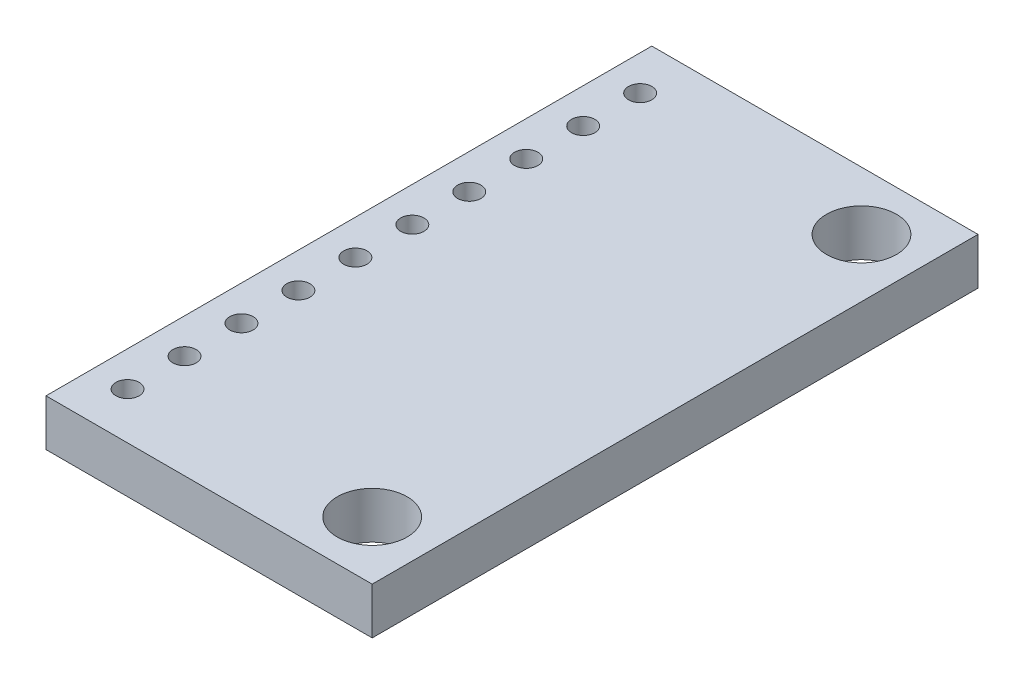
ISO-10303-21;
HEADER;
FILE_DESCRIPTION(('STEP AP214'),'2;1');
FILE_NAME('part.step','',(''),(''),'','','');
FILE_SCHEMA(('AUTOMOTIVE_DESIGN { 1 0 10303 214 1 1 1 1 }'));
ENDSEC;
DATA;
#1=APPLICATION_CONTEXT('core data for automotive mechanical design processes');
#2=APPLICATION_PROTOCOL_DEFINITION('international standard','automotive_design',2000,#1);
#3=PRODUCT_CONTEXT('',#1,'mechanical');
#4=PRODUCT('Part','Part','',(#3));
#5=PRODUCT_RELATED_PRODUCT_CATEGORY('part','',(#4));
#6=PRODUCT_DEFINITION_FORMATION('','',#4);
#7=PRODUCT_DEFINITION_CONTEXT('part definition',#1,'design');
#8=PRODUCT_DEFINITION('design','',#6,#7);
#9=PRODUCT_DEFINITION_SHAPE('','',#8);
#10=(LENGTH_UNIT() NAMED_UNIT(*) SI_UNIT(.MILLI.,.METRE.));
#11=(NAMED_UNIT(*) PLANE_ANGLE_UNIT() SI_UNIT($,.RADIAN.));
#12=(NAMED_UNIT(*) SI_UNIT($,.STERADIAN.) SOLID_ANGLE_UNIT());
#13=UNCERTAINTY_MEASURE_WITH_UNIT(LENGTH_MEASURE(1.E-05),#10,'distance_accuracy_value','');
#14=(GEOMETRIC_REPRESENTATION_CONTEXT(3) GLOBAL_UNCERTAINTY_ASSIGNED_CONTEXT((#13)) GLOBAL_UNIT_ASSIGNED_CONTEXT((#10,
#11,#12)) REPRESENTATION_CONTEXT('',''));
#15=CARTESIAN_POINT('',(0.,0.,0.));
#16=DIRECTION('',(0.,0.,1.));
#17=DIRECTION('',(1.,0.,0.));
#18=AXIS2_PLACEMENT_3D('',#15,#16,#17);
#19=CARTESIAN_POINT('',(7.,2.,13.));
#20=DIRECTION('',(-1.,0.,0.));
#21=DIRECTION('',(0.,0.,1.));
#22=AXIS2_PLACEMENT_3D('',#19,#20,#21);
#23=PLANE('',#22);
#24=DIRECTION('',(0.,0.,-1.));
#25=VECTOR('',#24,1.);
#26=CARTESIAN_POINT('',(7.,0.,13.));
#27=LINE('',#26,#25);
#28=CARTESIAN_POINT('',(7.,0.,13.));
#29=VERTEX_POINT('',#28);
#30=CARTESIAN_POINT('',(7.,0.,-13.));
#31=VERTEX_POINT('',#30);
#32=EDGE_CURVE('E111',#29,#31,#27,.T.);
#33=ORIENTED_EDGE('',*,*,#32,.T.);
#34=DIRECTION('',(0.,-1.,0.));
#35=VECTOR('',#34,1.);
#36=CARTESIAN_POINT('',(7.,2.,-13.));
#37=LINE('',#36,#35);
#38=CARTESIAN_POINT('',(7.,2.,-13.));
#39=VERTEX_POINT('',#38);
#40=EDGE_CURVE('E11',#39,#31,#37,.T.);
#41=ORIENTED_EDGE('',*,*,#40,.F.);
#42=DIRECTION('',(0.,0.,-1.));
#43=VECTOR('',#42,1.);
#44=CARTESIAN_POINT('',(7.,2.,13.));
#45=LINE('',#44,#43);
#46=CARTESIAN_POINT('',(7.,2.,13.));
#47=VERTEX_POINT('',#46);
#48=EDGE_CURVE('E95',#47,#39,#45,.T.);
#49=ORIENTED_EDGE('',*,*,#48,.F.);
#50=DIRECTION('',(0.,-1.,0.));
#51=VECTOR('',#50,1.);
#52=CARTESIAN_POINT('',(7.,2.,13.));
#53=LINE('',#52,#51);
#54=EDGE_CURVE('E107',#47,#29,#53,.T.);
#55=ORIENTED_EDGE('',*,*,#54,.T.);
#56=EDGE_LOOP('',(#33,#41,#49,#55));
#57=FACE_BOUND('',#56,.T.);
#58=ADVANCED_FACE('F43',(#57),#23,.F.);
#59=CARTESIAN_POINT('',(-7.,2.,-13.));
#60=DIRECTION('',(0.,0.,1.));
#61=DIRECTION('',(1.,0.,0.));
#62=AXIS2_PLACEMENT_3D('',#59,#60,#61);
#63=PLANE('',#62);
#64=DIRECTION('',(-1.,0.,0.));
#65=VECTOR('',#64,1.);
#66=CARTESIAN_POINT('',(-7.,0.,-13.));
#67=LINE('',#66,#65);
#68=CARTESIAN_POINT('',(-7.,0.,-13.));
#69=VERTEX_POINT('',#68);
#70=EDGE_CURVE('E100',#31,#69,#67,.T.);
#71=ORIENTED_EDGE('',*,*,#70,.T.);
#72=DIRECTION('',(0.,-1.,0.));
#73=VECTOR('',#72,1.);
#74=CARTESIAN_POINT('',(-7.,2.,-13.));
#75=LINE('',#74,#73);
#76=CARTESIAN_POINT('',(-7.,2.,-13.));
#77=VERTEX_POINT('',#76);
#78=EDGE_CURVE('E52',#77,#69,#75,.T.);
#79=ORIENTED_EDGE('',*,*,#78,.F.);
#80=DIRECTION('',(-1.,0.,0.));
#81=VECTOR('',#80,1.);
#82=CARTESIAN_POINT('',(-7.,2.,-13.));
#83=LINE('',#82,#81);
#84=EDGE_CURVE('E90',#39,#77,#83,.T.);
#85=ORIENTED_EDGE('',*,*,#84,.F.);
#86=ORIENTED_EDGE('',*,*,#40,.T.);
#87=EDGE_LOOP('',(#71,#79,#85,#86));
#88=FACE_BOUND('',#87,.T.);
#89=ADVANCED_FACE('F99',(#88),#63,.F.);
#90=CARTESIAN_POINT('',(-7.,2.,13.));
#91=DIRECTION('',(1.,0.,0.));
#92=DIRECTION('',(0.,0.,-1.));
#93=AXIS2_PLACEMENT_3D('',#90,#91,#92);
#94=PLANE('',#93);
#95=DIRECTION('',(0.,0.,1.));
#96=VECTOR('',#95,1.);
#97=CARTESIAN_POINT('',(-7.,0.,13.));
#98=LINE('',#97,#96);
#99=CARTESIAN_POINT('',(-7.,0.,13.));
#100=VERTEX_POINT('',#99);
#101=EDGE_CURVE('E77',#69,#100,#98,.T.);
#102=ORIENTED_EDGE('',*,*,#101,.T.);
#103=DIRECTION('',(0.,-1.,0.));
#104=VECTOR('',#103,1.);
#105=CARTESIAN_POINT('',(-7.,2.,13.));
#106=LINE('',#105,#104);
#107=CARTESIAN_POINT('',(-7.,2.,13.));
#108=VERTEX_POINT('',#107);
#109=EDGE_CURVE('E102',#108,#100,#106,.T.);
#110=ORIENTED_EDGE('',*,*,#109,.F.);
#111=DIRECTION('',(0.,0.,1.));
#112=VECTOR('',#111,1.);
#113=CARTESIAN_POINT('',(-7.,2.,13.));
#114=LINE('',#113,#112);
#115=EDGE_CURVE('E93',#77,#108,#114,.T.);
#116=ORIENTED_EDGE('',*,*,#115,.F.);
#117=ORIENTED_EDGE('',*,*,#78,.T.);
#118=EDGE_LOOP('',(#102,#110,#116,#117));
#119=FACE_BOUND('',#118,.T.);
#120=ADVANCED_FACE('F103',(#119),#94,.F.);
#121=CARTESIAN_POINT('',(-7.,2.,13.));
#122=DIRECTION('',(0.,0.,-1.));
#123=DIRECTION('',(-1.,0.,0.));
#124=AXIS2_PLACEMENT_3D('',#121,#122,#123);
#125=PLANE('',#124);
#126=DIRECTION('',(1.,0.,0.));
#127=VECTOR('',#126,1.);
#128=CARTESIAN_POINT('',(-7.,0.,13.));
#129=LINE('',#128,#127);
#130=EDGE_CURVE('E83',#100,#29,#129,.T.);
#131=ORIENTED_EDGE('',*,*,#130,.T.);
#132=ORIENTED_EDGE('',*,*,#54,.F.);
#133=DIRECTION('',(1.,0.,0.));
#134=VECTOR('',#133,1.);
#135=CARTESIAN_POINT('',(-7.,2.,13.));
#136=LINE('',#135,#134);
#137=EDGE_CURVE('E60',#108,#47,#136,.T.);
#138=ORIENTED_EDGE('',*,*,#137,.F.);
#139=ORIENTED_EDGE('',*,*,#109,.T.);
#140=EDGE_LOOP('',(#131,#132,#138,#139));
#141=FACE_BOUND('',#140,.T.);
#142=ADVANCED_FACE('F125',(#141),#125,.F.);
#143=CARTESIAN_POINT('',(0.,2.,0.));
#144=DIRECTION('',(0.,-1.,0.));
#145=DIRECTION('',(0.,0.,-1.));
#146=AXIS2_PLACEMENT_3D('',#143,#144,#145);
#147=PLANE('',#146);
#148=CARTESIAN_POINT('',(-5.5,2.,-11.));
#149=DIRECTION('',(0.,1.,0.));
#150=DIRECTION('',(0.,0.,1.));
#151=AXIS2_PLACEMENT_3D('',#148,#149,#150);
#152=CIRCLE('',#151,0.500000000000001);
#153=CARTESIAN_POINT('',(-5.5,2.,-10.5));
#154=VERTEX_POINT('',#153);
#155=EDGE_CURVE('E220',#154,#154,#152,.T.);
#156=ORIENTED_EDGE('',*,*,#155,.F.);
#157=EDGE_LOOP('',(#156));
#158=FACE_BOUND('',#157,.T.);
#159=CARTESIAN_POINT('',(-5.5,2.,-8.555556));
#160=DIRECTION('',(0.,1.,0.));
#161=DIRECTION('',(0.,0.,1.));
#162=AXIS2_PLACEMENT_3D('',#159,#160,#161);
#163=CIRCLE('',#162,0.500000000000001);
#164=CARTESIAN_POINT('',(-5.5,2.,-8.055556));
#165=VERTEX_POINT('',#164);
#166=EDGE_CURVE('E216',#165,#165,#163,.T.);
#167=ORIENTED_EDGE('',*,*,#166,.F.);
#168=EDGE_LOOP('',(#167));
#169=FACE_BOUND('',#168,.T.);
#170=CARTESIAN_POINT('',(-5.5,2.,-6.111112));
#171=DIRECTION('',(0.,1.,0.));
#172=DIRECTION('',(0.,0.,1.));
#173=AXIS2_PLACEMENT_3D('',#170,#171,#172);
#174=CIRCLE('',#173,0.500000000000001);
#175=CARTESIAN_POINT('',(-5.5,2.,-5.611112));
#176=VERTEX_POINT('',#175);
#177=EDGE_CURVE('E208',#176,#176,#174,.T.);
#178=ORIENTED_EDGE('',*,*,#177,.F.);
#179=EDGE_LOOP('',(#178));
#180=FACE_BOUND('',#179,.T.);
#181=CARTESIAN_POINT('',(-5.5,2.,-3.666668));
#182=DIRECTION('',(0.,1.,0.));
#183=DIRECTION('',(0.,0.,1.));
#184=AXIS2_PLACEMENT_3D('',#181,#182,#183);
#185=CIRCLE('',#184,0.500000000000001);
#186=CARTESIAN_POINT('',(-5.5,2.,-3.166668));
#187=VERTEX_POINT('',#186);
#188=EDGE_CURVE('E200',#187,#187,#185,.T.);
#189=ORIENTED_EDGE('',*,*,#188,.F.);
#190=EDGE_LOOP('',(#189));
#191=FACE_BOUND('',#190,.T.);
#192=CARTESIAN_POINT('',(-5.5,2.,-1.222224));
#193=DIRECTION('',(0.,1.,0.));
#194=DIRECTION('',(0.,0.,1.));
#195=AXIS2_PLACEMENT_3D('',#192,#193,#194);
#196=CIRCLE('',#195,0.500000000000001);
#197=CARTESIAN_POINT('',(-5.5,2.,-0.722224));
#198=VERTEX_POINT('',#197);
#199=EDGE_CURVE('E192',#198,#198,#196,.T.);
#200=ORIENTED_EDGE('',*,*,#199,.F.);
#201=EDGE_LOOP('',(#200));
#202=FACE_BOUND('',#201,.T.);
#203=CARTESIAN_POINT('',(-5.5,2.,1.22222));
#204=DIRECTION('',(0.,1.,0.));
#205=DIRECTION('',(0.,0.,1.));
#206=AXIS2_PLACEMENT_3D('',#203,#204,#205);
#207=CIRCLE('',#206,0.500000000000001);
#208=CARTESIAN_POINT('',(-5.5,2.,1.72222));
#209=VERTEX_POINT('',#208);
#210=EDGE_CURVE('E184',#209,#209,#207,.T.);
#211=ORIENTED_EDGE('',*,*,#210,.F.);
#212=EDGE_LOOP('',(#211));
#213=FACE_BOUND('',#212,.T.);
#214=CARTESIAN_POINT('',(-5.5,2.,3.666664));
#215=DIRECTION('',(0.,1.,0.));
#216=DIRECTION('',(0.,0.,1.));
#217=AXIS2_PLACEMENT_3D('',#214,#215,#216);
#218=CIRCLE('',#217,0.500000000000001);
#219=CARTESIAN_POINT('',(-5.5,2.,4.166664));
#220=VERTEX_POINT('',#219);
#221=EDGE_CURVE('E176',#220,#220,#218,.T.);
#222=ORIENTED_EDGE('',*,*,#221,.F.);
#223=EDGE_LOOP('',(#222));
#224=FACE_BOUND('',#223,.T.);
#225=CARTESIAN_POINT('',(-5.5,2.,6.111108));
#226=DIRECTION('',(0.,1.,0.));
#227=DIRECTION('',(0.,0.,1.));
#228=AXIS2_PLACEMENT_3D('',#225,#226,#227);
#229=CIRCLE('',#228,0.500000000000001);
#230=CARTESIAN_POINT('',(-5.5,2.,6.611108));
#231=VERTEX_POINT('',#230);
#232=EDGE_CURVE('E168',#231,#231,#229,.T.);
#233=ORIENTED_EDGE('',*,*,#232,.F.);
#234=EDGE_LOOP('',(#233));
#235=FACE_BOUND('',#234,.T.);
#236=CARTESIAN_POINT('',(-5.5,2.,8.555552));
#237=DIRECTION('',(0.,1.,0.));
#238=DIRECTION('',(0.,0.,1.));
#239=AXIS2_PLACEMENT_3D('',#236,#237,#238);
#240=CIRCLE('',#239,0.500000000000001);
#241=CARTESIAN_POINT('',(-5.5,2.,9.055552));
#242=VERTEX_POINT('',#241);
#243=EDGE_CURVE('E160',#242,#242,#240,.T.);
#244=ORIENTED_EDGE('',*,*,#243,.F.);
#245=EDGE_LOOP('',(#244));
#246=FACE_BOUND('',#245,.T.);
#247=CARTESIAN_POINT('',(-5.5,2.,10.999996));
#248=DIRECTION('',(0.,1.,0.));
#249=DIRECTION('',(0.,0.,1.));
#250=AXIS2_PLACEMENT_3D('',#247,#248,#249);
#251=CIRCLE('',#250,0.500000000000001);
#252=CARTESIAN_POINT('',(-5.5,2.,11.499996));
#253=VERTEX_POINT('',#252);
#254=EDGE_CURVE('E152',#253,#253,#251,.T.);
#255=ORIENTED_EDGE('',*,*,#254,.F.);
#256=EDGE_LOOP('',(#255));
#257=FACE_BOUND('',#256,.T.);
#258=CARTESIAN_POINT('',(4.5,2.,-10.5));
#259=DIRECTION('',(0.,1.,0.));
#260=DIRECTION('',(0.,0.,1.));
#261=AXIS2_PLACEMENT_3D('',#258,#259,#260);
#262=CIRCLE('',#261,1.5);
#263=CARTESIAN_POINT('',(4.5,2.,-9.));
#264=VERTEX_POINT('',#263);
#265=EDGE_CURVE('E141',#264,#264,#262,.T.);
#266=ORIENTED_EDGE('',*,*,#265,.F.);
#267=EDGE_LOOP('',(#266));
#268=FACE_BOUND('',#267,.T.);
#269=CARTESIAN_POINT('',(4.5,2.,10.5));
#270=DIRECTION('',(0.,1.,0.));
#271=DIRECTION('',(0.,0.,1.));
#272=AXIS2_PLACEMENT_3D('',#269,#270,#271);
#273=CIRCLE('',#272,1.5);
#274=CARTESIAN_POINT('',(4.5,2.,12.));
#275=VERTEX_POINT('',#274);
#276=EDGE_CURVE('E136',#275,#275,#273,.T.);
#277=ORIENTED_EDGE('',*,*,#276,.F.);
#278=EDGE_LOOP('',(#277));
#279=FACE_BOUND('',#278,.T.);
#280=ORIENTED_EDGE('',*,*,#48,.T.);
#281=ORIENTED_EDGE('',*,*,#84,.T.);
#282=ORIENTED_EDGE('',*,*,#115,.T.);
#283=ORIENTED_EDGE('',*,*,#137,.T.);
#284=EDGE_LOOP('',(#280,#281,#282,#283));
#285=FACE_BOUND('',#284,.T.);
#286=ADVANCED_FACE('F91',(#158,#169,#180,#191,#202,#213,#224,#235,#246,#257,#268,#279,#285),
#147,.F.);
#287=CARTESIAN_POINT('',(0.,0.,0.));
#288=DIRECTION('',(0.,-1.,0.));
#289=DIRECTION('',(0.,0.,-1.));
#290=AXIS2_PLACEMENT_3D('',#287,#288,#289);
#291=PLANE('',#290);
#292=CARTESIAN_POINT('',(-5.5,0.,-11.));
#293=DIRECTION('',(0.,1.,0.));
#294=DIRECTION('',(0.,0.,1.));
#295=AXIS2_PLACEMENT_3D('',#292,#293,#294);
#296=CIRCLE('',#295,0.500000000000001);
#297=CARTESIAN_POINT('',(-5.5,0.,-10.5));
#298=VERTEX_POINT('',#297);
#299=EDGE_CURVE('E137',#298,#298,#296,.T.);
#300=ORIENTED_EDGE('',*,*,#299,.T.);
#301=EDGE_LOOP('',(#300));
#302=FACE_BOUND('',#301,.T.);
#303=CARTESIAN_POINT('',(-5.5,0.,-8.555556));
#304=DIRECTION('',(0.,1.,0.));
#305=DIRECTION('',(0.,0.,1.));
#306=AXIS2_PLACEMENT_3D('',#303,#304,#305);
#307=CIRCLE('',#306,0.500000000000001);
#308=CARTESIAN_POINT('',(-5.5,0.,-8.055556));
#309=VERTEX_POINT('',#308);
#310=EDGE_CURVE('E212',#309,#309,#307,.T.);
#311=ORIENTED_EDGE('',*,*,#310,.T.);
#312=EDGE_LOOP('',(#311));
#313=FACE_BOUND('',#312,.T.);
#314=CARTESIAN_POINT('',(-5.5,0.,-6.111112));
#315=DIRECTION('',(0.,1.,0.));
#316=DIRECTION('',(0.,0.,1.));
#317=AXIS2_PLACEMENT_3D('',#314,#315,#316);
#318=CIRCLE('',#317,0.500000000000001);
#319=CARTESIAN_POINT('',(-5.5,0.,-5.611112));
#320=VERTEX_POINT('',#319);
#321=EDGE_CURVE('E204',#320,#320,#318,.T.);
#322=ORIENTED_EDGE('',*,*,#321,.T.);
#323=EDGE_LOOP('',(#322));
#324=FACE_BOUND('',#323,.T.);
#325=CARTESIAN_POINT('',(-5.5,0.,-3.666668));
#326=DIRECTION('',(0.,1.,0.));
#327=DIRECTION('',(0.,0.,1.));
#328=AXIS2_PLACEMENT_3D('',#325,#326,#327);
#329=CIRCLE('',#328,0.500000000000001);
#330=CARTESIAN_POINT('',(-5.5,0.,-3.166668));
#331=VERTEX_POINT('',#330);
#332=EDGE_CURVE('E196',#331,#331,#329,.T.);
#333=ORIENTED_EDGE('',*,*,#332,.T.);
#334=EDGE_LOOP('',(#333));
#335=FACE_BOUND('',#334,.T.);
#336=CARTESIAN_POINT('',(-5.5,0.,-1.222224));
#337=DIRECTION('',(0.,1.,0.));
#338=DIRECTION('',(0.,0.,1.));
#339=AXIS2_PLACEMENT_3D('',#336,#337,#338);
#340=CIRCLE('',#339,0.500000000000001);
#341=CARTESIAN_POINT('',(-5.5,0.,-0.722224));
#342=VERTEX_POINT('',#341);
#343=EDGE_CURVE('E188',#342,#342,#340,.T.);
#344=ORIENTED_EDGE('',*,*,#343,.T.);
#345=EDGE_LOOP('',(#344));
#346=FACE_BOUND('',#345,.T.);
#347=CARTESIAN_POINT('',(-5.5,0.,1.22222));
#348=DIRECTION('',(0.,1.,0.));
#349=DIRECTION('',(0.,0.,1.));
#350=AXIS2_PLACEMENT_3D('',#347,#348,#349);
#351=CIRCLE('',#350,0.500000000000001);
#352=CARTESIAN_POINT('',(-5.5,0.,1.72222));
#353=VERTEX_POINT('',#352);
#354=EDGE_CURVE('E180',#353,#353,#351,.T.);
#355=ORIENTED_EDGE('',*,*,#354,.T.);
#356=EDGE_LOOP('',(#355));
#357=FACE_BOUND('',#356,.T.);
#358=CARTESIAN_POINT('',(-5.5,0.,3.666664));
#359=DIRECTION('',(0.,1.,0.));
#360=DIRECTION('',(0.,0.,1.));
#361=AXIS2_PLACEMENT_3D('',#358,#359,#360);
#362=CIRCLE('',#361,0.500000000000001);
#363=CARTESIAN_POINT('',(-5.5,0.,4.166664));
#364=VERTEX_POINT('',#363);
#365=EDGE_CURVE('E172',#364,#364,#362,.T.);
#366=ORIENTED_EDGE('',*,*,#365,.T.);
#367=EDGE_LOOP('',(#366));
#368=FACE_BOUND('',#367,.T.);
#369=CARTESIAN_POINT('',(-5.5,0.,6.111108));
#370=DIRECTION('',(0.,1.,0.));
#371=DIRECTION('',(0.,0.,1.));
#372=AXIS2_PLACEMENT_3D('',#369,#370,#371);
#373=CIRCLE('',#372,0.500000000000001);
#374=CARTESIAN_POINT('',(-5.5,0.,6.611108));
#375=VERTEX_POINT('',#374);
#376=EDGE_CURVE('E164',#375,#375,#373,.T.);
#377=ORIENTED_EDGE('',*,*,#376,.T.);
#378=EDGE_LOOP('',(#377));
#379=FACE_BOUND('',#378,.T.);
#380=CARTESIAN_POINT('',(-5.5,0.,8.555552));
#381=DIRECTION('',(0.,1.,0.));
#382=DIRECTION('',(0.,0.,1.));
#383=AXIS2_PLACEMENT_3D('',#380,#381,#382);
#384=CIRCLE('',#383,0.500000000000001);
#385=CARTESIAN_POINT('',(-5.5,0.,9.055552));
#386=VERTEX_POINT('',#385);
#387=EDGE_CURVE('E156',#386,#386,#384,.T.);
#388=ORIENTED_EDGE('',*,*,#387,.T.);
#389=EDGE_LOOP('',(#388));
#390=FACE_BOUND('',#389,.T.);
#391=CARTESIAN_POINT('',(-5.5,0.,10.999996));
#392=DIRECTION('',(0.,1.,0.));
#393=DIRECTION('',(0.,0.,1.));
#394=AXIS2_PLACEMENT_3D('',#391,#392,#393);
#395=CIRCLE('',#394,0.500000000000001);
#396=CARTESIAN_POINT('',(-5.5,0.,11.499996));
#397=VERTEX_POINT('',#396);
#398=EDGE_CURVE('E148',#397,#397,#395,.T.);
#399=ORIENTED_EDGE('',*,*,#398,.T.);
#400=EDGE_LOOP('',(#399));
#401=FACE_BOUND('',#400,.T.);
#402=CARTESIAN_POINT('',(4.5,0.,-10.5));
#403=DIRECTION('',(0.,1.,0.));
#404=DIRECTION('',(0.,0.,1.));
#405=AXIS2_PLACEMENT_3D('',#402,#403,#404);
#406=CIRCLE('',#405,1.5);
#407=CARTESIAN_POINT('',(4.5,0.,-9.));
#408=VERTEX_POINT('',#407);
#409=EDGE_CURVE('E115',#408,#408,#406,.T.);
#410=ORIENTED_EDGE('',*,*,#409,.T.);
#411=EDGE_LOOP('',(#410));
#412=FACE_BOUND('',#411,.T.);
#413=CARTESIAN_POINT('',(4.5,0.,10.5));
#414=DIRECTION('',(0.,1.,0.));
#415=DIRECTION('',(0.,0.,1.));
#416=AXIS2_PLACEMENT_3D('',#413,#414,#415);
#417=CIRCLE('',#416,1.5);
#418=CARTESIAN_POINT('',(4.5,0.,12.));
#419=VERTEX_POINT('',#418);
#420=EDGE_CURVE('E132',#419,#419,#417,.T.);
#421=ORIENTED_EDGE('',*,*,#420,.T.);
#422=EDGE_LOOP('',(#421));
#423=FACE_BOUND('',#422,.T.);
#424=ORIENTED_EDGE('',*,*,#32,.F.);
#425=ORIENTED_EDGE('',*,*,#130,.F.);
#426=ORIENTED_EDGE('',*,*,#101,.F.);
#427=ORIENTED_EDGE('',*,*,#70,.F.);
#428=EDGE_LOOP('',(#424,#425,#426,#427));
#429=FACE_BOUND('',#428,.T.);
#430=ADVANCED_FACE('F128',(#302,#313,#324,#335,#346,#357,#368,#379,#390,#401,#412,#423,#429),
#291,.T.);
#431=CARTESIAN_POINT('',(4.5,0.,10.5));
#432=DIRECTION('',(0.,1.,0.));
#433=DIRECTION('',(0.,0.,1.));
#434=AXIS2_PLACEMENT_3D('',#431,#432,#433);
#435=CYLINDRICAL_SURFACE('',#434,1.5);
#436=ORIENTED_EDGE('',*,*,#420,.F.);
#437=EDGE_LOOP('',(#436));
#438=FACE_BOUND('',#437,.T.);
#439=ORIENTED_EDGE('',*,*,#276,.T.);
#440=EDGE_LOOP('',(#439));
#441=FACE_BOUND('',#440,.T.);
#442=ADVANCED_FACE('F262',(#438,#441),#435,.F.);
#443=CARTESIAN_POINT('',(4.5,0.,-10.5));
#444=DIRECTION('',(0.,1.,0.));
#445=DIRECTION('',(0.,0.,1.));
#446=AXIS2_PLACEMENT_3D('',#443,#444,#445);
#447=CYLINDRICAL_SURFACE('',#446,1.5);
#448=ORIENTED_EDGE('',*,*,#409,.F.);
#449=EDGE_LOOP('',(#448));
#450=FACE_BOUND('',#449,.T.);
#451=ORIENTED_EDGE('',*,*,#265,.T.);
#452=EDGE_LOOP('',(#451));
#453=FACE_BOUND('',#452,.T.);
#454=ADVANCED_FACE('F264',(#450,#453),#447,.F.);
#455=CARTESIAN_POINT('',(-5.5,0.,10.999996));
#456=DIRECTION('',(0.,1.,0.));
#457=DIRECTION('',(0.,0.,1.));
#458=AXIS2_PLACEMENT_3D('',#455,#456,#457);
#459=CYLINDRICAL_SURFACE('',#458,0.500000000000001);
#460=ORIENTED_EDGE('',*,*,#398,.F.);
#461=EDGE_LOOP('',(#460));
#462=FACE_BOUND('',#461,.T.);
#463=ORIENTED_EDGE('',*,*,#254,.T.);
#464=EDGE_LOOP('',(#463));
#465=FACE_BOUND('',#464,.T.);
#466=ADVANCED_FACE('F271',(#462,#465),#459,.F.);
#467=CARTESIAN_POINT('',(-5.5,0.,8.555552));
#468=DIRECTION('',(0.,1.,0.));
#469=DIRECTION('',(0.,0.,1.));
#470=AXIS2_PLACEMENT_3D('',#467,#468,#469);
#471=CYLINDRICAL_SURFACE('',#470,0.500000000000001);
#472=ORIENTED_EDGE('',*,*,#387,.F.);
#473=EDGE_LOOP('',(#472));
#474=FACE_BOUND('',#473,.T.);
#475=ORIENTED_EDGE('',*,*,#243,.T.);
#476=EDGE_LOOP('',(#475));
#477=FACE_BOUND('',#476,.T.);
#478=ADVANCED_FACE('F310',(#474,#477),#471,.F.);
#479=CARTESIAN_POINT('',(-5.5,0.,6.111108));
#480=DIRECTION('',(0.,1.,0.));
#481=DIRECTION('',(0.,0.,1.));
#482=AXIS2_PLACEMENT_3D('',#479,#480,#481);
#483=CYLINDRICAL_SURFACE('',#482,0.500000000000001);
#484=ORIENTED_EDGE('',*,*,#376,.F.);
#485=EDGE_LOOP('',(#484));
#486=FACE_BOUND('',#485,.T.);
#487=ORIENTED_EDGE('',*,*,#232,.T.);
#488=EDGE_LOOP('',(#487));
#489=FACE_BOUND('',#488,.T.);
#490=ADVANCED_FACE('F322',(#486,#489),#483,.F.);
#491=CARTESIAN_POINT('',(-5.5,0.,3.666664));
#492=DIRECTION('',(0.,1.,0.));
#493=DIRECTION('',(0.,0.,1.));
#494=AXIS2_PLACEMENT_3D('',#491,#492,#493);
#495=CYLINDRICAL_SURFACE('',#494,0.500000000000001);
#496=ORIENTED_EDGE('',*,*,#365,.F.);
#497=EDGE_LOOP('',(#496));
#498=FACE_BOUND('',#497,.T.);
#499=ORIENTED_EDGE('',*,*,#221,.T.);
#500=EDGE_LOOP('',(#499));
#501=FACE_BOUND('',#500,.T.);
#502=ADVANCED_FACE('F333',(#498,#501),#495,.F.);
#503=CARTESIAN_POINT('',(-5.5,0.,1.22222));
#504=DIRECTION('',(0.,1.,0.));
#505=DIRECTION('',(0.,0.,1.));
#506=AXIS2_PLACEMENT_3D('',#503,#504,#505);
#507=CYLINDRICAL_SURFACE('',#506,0.500000000000001);
#508=ORIENTED_EDGE('',*,*,#354,.F.);
#509=EDGE_LOOP('',(#508));
#510=FACE_BOUND('',#509,.T.);
#511=ORIENTED_EDGE('',*,*,#210,.T.);
#512=EDGE_LOOP('',(#511));
#513=FACE_BOUND('',#512,.T.);
#514=ADVANCED_FACE('F344',(#510,#513),#507,.F.);
#515=CARTESIAN_POINT('',(-5.5,0.,-1.222224));
#516=DIRECTION('',(0.,1.,0.));
#517=DIRECTION('',(0.,0.,1.));
#518=AXIS2_PLACEMENT_3D('',#515,#516,#517);
#519=CYLINDRICAL_SURFACE('',#518,0.500000000000001);
#520=ORIENTED_EDGE('',*,*,#343,.F.);
#521=EDGE_LOOP('',(#520));
#522=FACE_BOUND('',#521,.T.);
#523=ORIENTED_EDGE('',*,*,#199,.T.);
#524=EDGE_LOOP('',(#523));
#525=FACE_BOUND('',#524,.T.);
#526=ADVANCED_FACE('F355',(#522,#525),#519,.F.);
#527=CARTESIAN_POINT('',(-5.5,0.,-3.666668));
#528=DIRECTION('',(0.,1.,0.));
#529=DIRECTION('',(0.,0.,1.));
#530=AXIS2_PLACEMENT_3D('',#527,#528,#529);
#531=CYLINDRICAL_SURFACE('',#530,0.500000000000001);
#532=ORIENTED_EDGE('',*,*,#332,.F.);
#533=EDGE_LOOP('',(#532));
#534=FACE_BOUND('',#533,.T.);
#535=ORIENTED_EDGE('',*,*,#188,.T.);
#536=EDGE_LOOP('',(#535));
#537=FACE_BOUND('',#536,.T.);
#538=ADVANCED_FACE('F366',(#534,#537),#531,.F.);
#539=CARTESIAN_POINT('',(-5.5,0.,-6.111112));
#540=DIRECTION('',(0.,1.,0.));
#541=DIRECTION('',(0.,0.,1.));
#542=AXIS2_PLACEMENT_3D('',#539,#540,#541);
#543=CYLINDRICAL_SURFACE('',#542,0.500000000000001);
#544=ORIENTED_EDGE('',*,*,#321,.F.);
#545=EDGE_LOOP('',(#544));
#546=FACE_BOUND('',#545,.T.);
#547=ORIENTED_EDGE('',*,*,#177,.T.);
#548=EDGE_LOOP('',(#547));
#549=FACE_BOUND('',#548,.T.);
#550=ADVANCED_FACE('F377',(#546,#549),#543,.F.);
#551=CARTESIAN_POINT('',(-5.5,0.,-8.555556));
#552=DIRECTION('',(0.,1.,0.));
#553=DIRECTION('',(0.,0.,1.));
#554=AXIS2_PLACEMENT_3D('',#551,#552,#553);
#555=CYLINDRICAL_SURFACE('',#554,0.500000000000001);
#556=ORIENTED_EDGE('',*,*,#310,.F.);
#557=EDGE_LOOP('',(#556));
#558=FACE_BOUND('',#557,.T.);
#559=ORIENTED_EDGE('',*,*,#166,.T.);
#560=EDGE_LOOP('',(#559));
#561=FACE_BOUND('',#560,.T.);
#562=ADVANCED_FACE('F233',(#558,#561),#555,.F.);
#563=CARTESIAN_POINT('',(-5.5,0.,-11.));
#564=DIRECTION('',(0.,1.,0.));
#565=DIRECTION('',(0.,0.,1.));
#566=AXIS2_PLACEMENT_3D('',#563,#564,#565);
#567=CYLINDRICAL_SURFACE('',#566,0.500000000000001);
#568=ORIENTED_EDGE('',*,*,#299,.F.);
#569=EDGE_LOOP('',(#568));
#570=FACE_BOUND('',#569,.T.);
#571=ORIENTED_EDGE('',*,*,#155,.T.);
#572=EDGE_LOOP('',(#571));
#573=FACE_BOUND('',#572,.T.);
#574=ADVANCED_FACE('F230',(#570,#573),#567,.F.);
#575=CLOSED_SHELL('',(#58,#89,#120,#142,#286,#430,#442,#454,#466,#478,#490,#502,#514,#526,#538,
#550,#562,#574));
#576=MANIFOLD_SOLID_BREP('B2',#575);
#577=ADVANCED_BREP_SHAPE_REPRESENTATION('',(#18,#576),#14);
#578=SHAPE_DEFINITION_REPRESENTATION(#9,#577);
ENDSEC;
END-ISO-10303-21;
